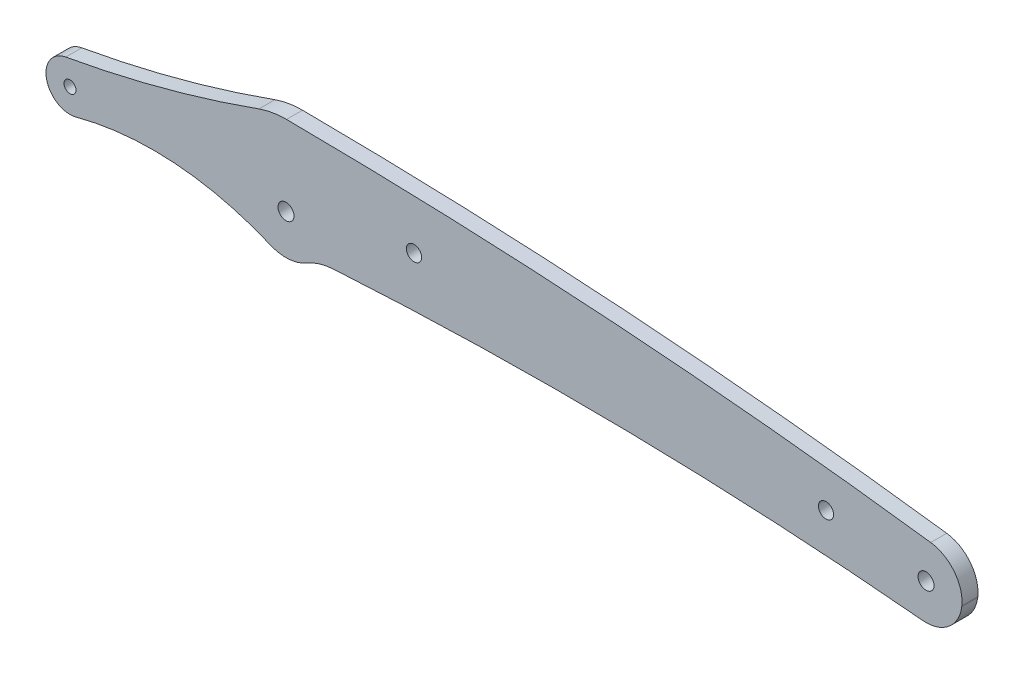
ISO-10303-21;
HEADER;
FILE_DESCRIPTION(('STEP AP214'),'2;1');
FILE_NAME('part.step','',(''),(''),'','','');
FILE_SCHEMA(('AUTOMOTIVE_DESIGN { 1 0 10303 214 1 1 1 1 }'));
ENDSEC;
DATA;
#1=APPLICATION_CONTEXT('core data for automotive mechanical design processes');
#2=APPLICATION_PROTOCOL_DEFINITION('international standard','automotive_design',2000,#1);
#3=PRODUCT_CONTEXT('',#1,'mechanical');
#4=PRODUCT('Part','Part','',(#3));
#5=PRODUCT_RELATED_PRODUCT_CATEGORY('part','',(#4));
#6=PRODUCT_DEFINITION_FORMATION('','',#4);
#7=PRODUCT_DEFINITION_CONTEXT('part definition',#1,'design');
#8=PRODUCT_DEFINITION('design','',#6,#7);
#9=PRODUCT_DEFINITION_SHAPE('','',#8);
#10=(LENGTH_UNIT() NAMED_UNIT(*) SI_UNIT(.MILLI.,.METRE.));
#11=(NAMED_UNIT(*) PLANE_ANGLE_UNIT() SI_UNIT($,.RADIAN.));
#12=(NAMED_UNIT(*) SI_UNIT($,.STERADIAN.) SOLID_ANGLE_UNIT());
#13=UNCERTAINTY_MEASURE_WITH_UNIT(LENGTH_MEASURE(1.E-05),#10,'distance_accuracy_value','');
#14=(GEOMETRIC_REPRESENTATION_CONTEXT(3) GLOBAL_UNCERTAINTY_ASSIGNED_CONTEXT((#13)) GLOBAL_UNIT_ASSIGNED_CONTEXT((#10,
#11,#12)) REPRESENTATION_CONTEXT('',''));
#15=CARTESIAN_POINT('',(0.,0.,0.));
#16=DIRECTION('',(0.,0.,1.));
#17=DIRECTION('',(1.,0.,0.));
#18=AXIS2_PLACEMENT_3D('',#15,#16,#17);
#19=CARTESIAN_POINT('',(160.000000000001,2.22044604925031E-13,4.));
#20=DIRECTION('',(0.,0.,1.));
#21=DIRECTION('',(1.,0.,0.));
#22=AXIS2_PLACEMENT_3D('',#19,#20,#21);
#23=PLANE('',#22);
#24=CARTESIAN_POINT('',(160.000000000001,2.22044604925031E-13,4.));
#25=DIRECTION('',(0.,0.,1.));
#26=DIRECTION('',(1.,0.,0.));
#27=AXIS2_PLACEMENT_3D('',#24,#25,#26);
#28=CIRCLE('',#27,2.);
#29=CARTESIAN_POINT('',(162.000000000001,2.22044604925031E-13,4.));
#30=VERTEX_POINT('',#29);
#31=EDGE_CURVE('E278',#30,#30,#28,.T.);
#32=ORIENTED_EDGE('',*,*,#31,.F.);
#33=EDGE_LOOP('',(#32));
#34=FACE_BOUND('',#33,.T.);
#35=CARTESIAN_POINT('',(0.,0.,4.));
#36=DIRECTION('',(0.,0.,1.));
#37=DIRECTION('',(1.,0.,0.));
#38=AXIS2_PLACEMENT_3D('',#35,#36,#37);
#39=CIRCLE('',#38,1.99999999999981);
#40=CARTESIAN_POINT('',(1.99999999999981,0.,4.));
#41=VERTEX_POINT('',#40);
#42=EDGE_CURVE('E283',#41,#41,#39,.T.);
#43=ORIENTED_EDGE('',*,*,#42,.F.);
#44=EDGE_LOOP('',(#43));
#45=FACE_BOUND('',#44,.T.);
#46=CARTESIAN_POINT('',(135.,2.80000000000036,4.));
#47=DIRECTION('',(0.,0.,1.));
#48=DIRECTION('',(1.,0.,0.));
#49=AXIS2_PLACEMENT_3D('',#46,#47,#48);
#50=CIRCLE('',#49,1.89999999999999);
#51=CARTESIAN_POINT('',(136.9,2.80000000000036,4.));
#52=VERTEX_POINT('',#51);
#53=EDGE_CURVE('E295',#52,#52,#50,.T.);
#54=ORIENTED_EDGE('',*,*,#53,.F.);
#55=EDGE_LOOP('',(#54));
#56=FACE_BOUND('',#55,.T.);
#57=CARTESIAN_POINT('',(160.000000000001,2.22044604925031E-13,4.));
#58=DIRECTION('',(0.,0.,1.));
#59=DIRECTION('',(1.,0.,0.));
#60=AXIS2_PLACEMENT_3D('',#57,#58,#59);
#61=CIRCLE('',#60,9.00000000000021);
#62=CARTESIAN_POINT('',(168.953879648192,-0.909966617905988,4.));
#63=VERTEX_POINT('',#62);
#64=CARTESIAN_POINT('',(161.173821165765,8.92312410934704,4.));
#65=VERTEX_POINT('',#64);
#66=EDGE_CURVE('E171',#63,#65,#61,.T.);
#67=ORIENTED_EDGE('',*,*,#66,.T.);
#68=CARTESIAN_POINT('',(-8.37812500000232,-1279.97258057409,4.));
#69=DIRECTION('',(0.,0.,1.));
#70=DIRECTION('',(1.,0.,0.));
#71=AXIS2_PLACEMENT_3D('',#68,#69,#70);
#72=CIRCLE('',#71,1300.);
#73=CARTESIAN_POINT('',(0.130908203289036,19.9995715714698,4.));
#74=VERTEX_POINT('',#73);
#75=EDGE_CURVE('E104',#65,#74,#72,.T.);
#76=ORIENTED_EDGE('',*,*,#75,.T.);
#77=CARTESIAN_POINT('',(0.,0.,4.));
#78=DIRECTION('',(0.,0.,1.));
#79=DIRECTION('',(1.,0.,0.));
#80=AXIS2_PLACEMENT_3D('',#77,#78,#79);
#81=CIRCLE('',#80,20.0000000000005);
#82=CARTESIAN_POINT('',(-6.75925925923691,18.8231882067423,4.));
#83=VERTEX_POINT('',#82);
#84=EDGE_CURVE('E195',#74,#83,#81,.T.);
#85=ORIENTED_EDGE('',*,*,#84,.T.);
#86=CARTESIAN_POINT('',(-108.14814814815,301.171011307739,4.));
#87=DIRECTION('',(0.,0.,-1.));
#88=DIRECTION('',(1.,0.,0.));
#89=AXIS2_PLACEMENT_3D('',#86,#87,#88);
#90=CIRCLE('',#89,300.);
#91=CARTESIAN_POINT('',(-55.0617283950615,5.90531394721067,4.));
#92=VERTEX_POINT('',#91);
#93=EDGE_CURVE('E214',#83,#92,#90,.T.);
#94=ORIENTED_EDGE('',*,*,#93,.T.);
#95=CARTESIAN_POINT('',(-54.0000000000002,2.22044604925031E-13,4.));
#96=DIRECTION('',(0.,0.,1.));
#97=DIRECTION('',(1.,0.,0.));
#98=AXIS2_PLACEMENT_3D('',#95,#96,#97);
#99=CIRCLE('',#98,6.00000000000002);
#100=CARTESIAN_POINT('',(-52.4554183813337,-5.79778126728451,4.));
#101=VERTEX_POINT('',#100);
#102=EDGE_CURVE('E211',#92,#101,#99,.T.);
#103=ORIENTED_EDGE('',*,*,#102,.T.);
#104=CARTESIAN_POINT('',(-33.1481481481481,-78.2700471083826,4.));
#105=DIRECTION('',(0.,0.,-1.));
#106=DIRECTION('',(1.,0.,0.));
#107=AXIS2_PLACEMENT_3D('',#104,#105,#106);
#108=CIRCLE('',#107,75.0000000000002);
#109=CARTESIAN_POINT('',(-3.89978213507676,-9.20824083627995,4.));
#110=VERTEX_POINT('',#109);
#111=EDGE_CURVE('E213',#101,#110,#108,.T.);
#112=ORIENTED_EDGE('',*,*,#111,.T.);
#113=CARTESIAN_POINT('',(0.,0.,4.));
#114=DIRECTION('',(0.,0.,1.));
#115=DIRECTION('',(1.,0.,0.));
#116=AXIS2_PLACEMENT_3D('',#113,#114,#115);
#117=CIRCLE('',#116,9.99999999999973);
#118=CARTESIAN_POINT('',(5.08680197539365,-8.60955548580331,4.));
#119=VERTEX_POINT('',#118);
#120=EDGE_CURVE('E216',#110,#119,#117,.T.);
#121=ORIENTED_EDGE('',*,*,#120,.T.);
#122=CARTESIAN_POINT('',(12.717004938478,-21.5238887145126,4.));
#123=DIRECTION('',(0.,0.,-1.));
#124=DIRECTION('',(1.,0.,0.));
#125=AXIS2_PLACEMENT_3D('',#122,#123,#124);
#126=CIRCLE('',#125,15.0000000000003);
#127=CARTESIAN_POINT('',(11.7980264082176,-6.55206589760323,4.));
#128=VERTEX_POINT('',#127);
#129=EDGE_CURVE('E132',#119,#128,#126,.T.);
#130=ORIENTED_EDGE('',*,*,#129,.T.);
#131=CARTESIAN_POINT('',(70.000000000003,-954.767510967984,4.));
#132=DIRECTION('',(0.,0.,-1.));
#133=DIRECTION('',(1.,0.,0.));
#134=AXIS2_PLACEMENT_3D('',#131,#132,#133);
#135=CIRCLE('',#134,950.);
#136=CARTESIAN_POINT('',(159.15537017727,-8.96027903932406,4.));
#137=VERTEX_POINT('',#136);
#138=EDGE_CURVE('E126',#128,#137,#135,.T.);
#139=ORIENTED_EDGE('',*,*,#138,.T.);
#140=CARTESIAN_POINT('',(160.000000000001,2.22044604925031E-13,4.));
#141=DIRECTION('',(0.,0.,1.));
#142=DIRECTION('',(1.,0.,0.));
#143=AXIS2_PLACEMENT_3D('',#140,#141,#142);
#144=CIRCLE('',#143,9.00000000000034);
#145=CARTESIAN_POINT('',(168.931448961832,-1.10870169216623,4.));
#146=VERTEX_POINT('',#145);
#147=EDGE_CURVE('E130',#137,#146,#144,.T.);
#148=ORIENTED_EDGE('',*,*,#147,.T.);
#149=DIRECTION('',(0.112155162604876,0.993690706156133,0.));
#150=VECTOR('',#149,1.);
#151=CARTESIAN_POINT('',(168.953879648192,-0.909966617905988,4.));
#152=LINE('',#151,#150);
#153=EDGE_CURVE('E52',#146,#63,#152,.T.);
#154=ORIENTED_EDGE('',*,*,#153,.T.);
#155=EDGE_LOOP('',(#67,#76,#85,#94,#103,#112,#121,#130,#139,#148,#154));
#156=FACE_BOUND('',#155,.T.);
#157=CARTESIAN_POINT('',(32.0000000000005,7.00000000000012,4.));
#158=DIRECTION('',(0.,0.,1.));
#159=DIRECTION('',(1.,0.,0.));
#160=AXIS2_PLACEMENT_3D('',#157,#158,#159);
#161=CIRCLE('',#160,1.90000000000003);
#162=CARTESIAN_POINT('',(33.9000000000005,7.00000000000012,4.));
#163=VERTEX_POINT('',#162);
#164=EDGE_CURVE('E154',#163,#163,#161,.T.);
#165=ORIENTED_EDGE('',*,*,#164,.F.);
#166=EDGE_LOOP('',(#165));
#167=FACE_BOUND('',#166,.T.);
#168=CARTESIAN_POINT('',(-54.0000000000002,2.22044604925031E-13,4.));
#169=DIRECTION('',(0.,0.,1.));
#170=DIRECTION('',(1.,0.,0.));
#171=AXIS2_PLACEMENT_3D('',#168,#169,#170);
#172=CIRCLE('',#171,1.50000000000003);
#173=CARTESIAN_POINT('',(-52.5000000000002,2.22044604925031E-13,4.));
#174=VERTEX_POINT('',#173);
#175=EDGE_CURVE('E289',#174,#174,#172,.T.);
#176=ORIENTED_EDGE('',*,*,#175,.F.);
#177=EDGE_LOOP('',(#176));
#178=FACE_BOUND('',#177,.T.);
#179=ADVANCED_FACE('F35',(#34,#45,#56,#156,#167,#178),#23,.T.);
#180=CARTESIAN_POINT('',(160.000000000001,2.22044604925031E-13,0.));
#181=DIRECTION('',(0.,0.,1.));
#182=DIRECTION('',(1.,0.,0.));
#183=AXIS2_PLACEMENT_3D('',#180,#181,#182);
#184=PLANE('',#183);
#185=CARTESIAN_POINT('',(160.000000000001,2.22044604925031E-13,0.));
#186=DIRECTION('',(0.,0.,1.));
#187=DIRECTION('',(1.,0.,0.));
#188=AXIS2_PLACEMENT_3D('',#185,#186,#187);
#189=CIRCLE('',#188,2.);
#190=CARTESIAN_POINT('',(162.000000000001,2.22044604925031E-13,0.));
#191=VERTEX_POINT('',#190);
#192=EDGE_CURVE('E276',#191,#191,#189,.T.);
#193=ORIENTED_EDGE('',*,*,#192,.T.);
#194=EDGE_LOOP('',(#193));
#195=FACE_BOUND('',#194,.T.);
#196=CARTESIAN_POINT('',(0.,0.,0.));
#197=DIRECTION('',(0.,0.,1.));
#198=DIRECTION('',(1.,0.,0.));
#199=AXIS2_PLACEMENT_3D('',#196,#197,#198);
#200=CIRCLE('',#199,1.99999999999981);
#201=CARTESIAN_POINT('',(1.99999999999981,0.,0.));
#202=VERTEX_POINT('',#201);
#203=EDGE_CURVE('E280',#202,#202,#200,.T.);
#204=ORIENTED_EDGE('',*,*,#203,.T.);
#205=EDGE_LOOP('',(#204));
#206=FACE_BOUND('',#205,.T.);
#207=CARTESIAN_POINT('',(135.,2.80000000000036,0.));
#208=DIRECTION('',(0.,0.,1.));
#209=DIRECTION('',(1.,0.,0.));
#210=AXIS2_PLACEMENT_3D('',#207,#208,#209);
#211=CIRCLE('',#210,1.89999999999999);
#212=CARTESIAN_POINT('',(136.9,2.80000000000036,0.));
#213=VERTEX_POINT('',#212);
#214=EDGE_CURVE('E292',#213,#213,#211,.T.);
#215=ORIENTED_EDGE('',*,*,#214,.T.);
#216=EDGE_LOOP('',(#215));
#217=FACE_BOUND('',#216,.T.);
#218=CARTESIAN_POINT('',(160.000000000001,2.22044604925031E-13,0.));
#219=DIRECTION('',(0.,0.,1.));
#220=DIRECTION('',(1.,0.,0.));
#221=AXIS2_PLACEMENT_3D('',#218,#219,#220);
#222=CIRCLE('',#221,9.00000000000021);
#223=CARTESIAN_POINT('',(168.953879648192,-0.909966617905988,0.));
#224=VERTEX_POINT('',#223);
#225=CARTESIAN_POINT('',(161.173821165765,8.92312410934704,0.));
#226=VERTEX_POINT('',#225);
#227=EDGE_CURVE('E150',#224,#226,#222,.T.);
#228=ORIENTED_EDGE('',*,*,#227,.F.);
#229=DIRECTION('',(0.112155162604876,0.993690706156133,0.));
#230=VECTOR('',#229,1.);
#231=CARTESIAN_POINT('',(168.953879648192,-0.909966617905988,0.));
#232=LINE('',#231,#230);
#233=CARTESIAN_POINT('',(168.931448961832,-1.10870169216623,0.));
#234=VERTEX_POINT('',#233);
#235=EDGE_CURVE('E96',#234,#224,#232,.T.);
#236=ORIENTED_EDGE('',*,*,#235,.F.);
#237=CARTESIAN_POINT('',(160.000000000001,2.22044604925031E-13,0.));
#238=DIRECTION('',(0.,0.,1.));
#239=DIRECTION('',(1.,0.,0.));
#240=AXIS2_PLACEMENT_3D('',#237,#238,#239);
#241=CIRCLE('',#240,9.00000000000034);
#242=CARTESIAN_POINT('',(159.15537017727,-8.96027903932406,0.));
#243=VERTEX_POINT('',#242);
#244=EDGE_CURVE('E90',#243,#234,#241,.T.);
#245=ORIENTED_EDGE('',*,*,#244,.F.);
#246=CARTESIAN_POINT('',(70.000000000003,-954.767510967984,0.));
#247=DIRECTION('',(0.,0.,-1.));
#248=DIRECTION('',(1.,0.,0.));
#249=AXIS2_PLACEMENT_3D('',#246,#247,#248);
#250=CIRCLE('',#249,950.);
#251=CARTESIAN_POINT('',(11.7980264082176,-6.55206589760323,0.));
#252=VERTEX_POINT('',#251);
#253=EDGE_CURVE('E140',#252,#243,#250,.T.);
#254=ORIENTED_EDGE('',*,*,#253,.F.);
#255=CARTESIAN_POINT('',(12.717004938478,-21.5238887145126,0.));
#256=DIRECTION('',(0.,0.,-1.));
#257=DIRECTION('',(1.,0.,0.));
#258=AXIS2_PLACEMENT_3D('',#255,#256,#257);
#259=CIRCLE('',#258,15.0000000000003);
#260=CARTESIAN_POINT('',(5.08680197539365,-8.60955548580331,0.));
#261=VERTEX_POINT('',#260);
#262=EDGE_CURVE('E166',#261,#252,#259,.T.);
#263=ORIENTED_EDGE('',*,*,#262,.F.);
#264=CARTESIAN_POINT('',(0.,0.,0.));
#265=DIRECTION('',(0.,0.,1.));
#266=DIRECTION('',(1.,0.,0.));
#267=AXIS2_PLACEMENT_3D('',#264,#265,#266);
#268=CIRCLE('',#267,9.99999999999973);
#269=CARTESIAN_POINT('',(-3.89978213507676,-9.20824083627995,0.));
#270=VERTEX_POINT('',#269);
#271=EDGE_CURVE('E164',#270,#261,#268,.T.);
#272=ORIENTED_EDGE('',*,*,#271,.F.);
#273=CARTESIAN_POINT('',(-33.1481481481481,-78.2700471083826,0.));
#274=DIRECTION('',(0.,0.,-1.));
#275=DIRECTION('',(1.,0.,0.));
#276=AXIS2_PLACEMENT_3D('',#273,#274,#275);
#277=CIRCLE('',#276,75.0000000000002);
#278=CARTESIAN_POINT('',(-52.4554183813337,-5.79778126728451,0.));
#279=VERTEX_POINT('',#278);
#280=EDGE_CURVE('E162',#279,#270,#277,.T.);
#281=ORIENTED_EDGE('',*,*,#280,.F.);
#282=CARTESIAN_POINT('',(-54.0000000000002,2.22044604925031E-13,0.));
#283=DIRECTION('',(0.,0.,1.));
#284=DIRECTION('',(1.,0.,0.));
#285=AXIS2_PLACEMENT_3D('',#282,#283,#284);
#286=CIRCLE('',#285,6.00000000000002);
#287=CARTESIAN_POINT('',(-55.0617283950615,5.90531394721067,0.));
#288=VERTEX_POINT('',#287);
#289=EDGE_CURVE('E160',#288,#279,#286,.T.);
#290=ORIENTED_EDGE('',*,*,#289,.F.);
#291=CARTESIAN_POINT('',(-108.14814814815,301.171011307739,0.));
#292=DIRECTION('',(0.,0.,-1.));
#293=DIRECTION('',(1.,0.,0.));
#294=AXIS2_PLACEMENT_3D('',#291,#292,#293);
#295=CIRCLE('',#294,300.);
#296=CARTESIAN_POINT('',(-6.75925925923691,18.8231882067423,0.));
#297=VERTEX_POINT('',#296);
#298=EDGE_CURVE('E158',#297,#288,#295,.T.);
#299=ORIENTED_EDGE('',*,*,#298,.F.);
#300=CARTESIAN_POINT('',(0.,0.,0.));
#301=DIRECTION('',(0.,0.,1.));
#302=DIRECTION('',(1.,0.,0.));
#303=AXIS2_PLACEMENT_3D('',#300,#301,#302);
#304=CIRCLE('',#303,20.0000000000005);
#305=CARTESIAN_POINT('',(0.130908203289036,19.9995715714698,0.));
#306=VERTEX_POINT('',#305);
#307=EDGE_CURVE('E156',#306,#297,#304,.T.);
#308=ORIENTED_EDGE('',*,*,#307,.F.);
#309=CARTESIAN_POINT('',(-8.37812500000232,-1279.97258057409,0.));
#310=DIRECTION('',(0.,0.,1.));
#311=DIRECTION('',(1.,0.,0.));
#312=AXIS2_PLACEMENT_3D('',#309,#310,#311);
#313=CIRCLE('',#312,1300.);
#314=EDGE_CURVE('E153',#226,#306,#313,.T.);
#315=ORIENTED_EDGE('',*,*,#314,.F.);
#316=EDGE_LOOP('',(#228,#236,#245,#254,#263,#272,#281,#290,#299,#308,#315));
#317=FACE_BOUND('',#316,.T.);
#318=CARTESIAN_POINT('',(32.0000000000005,7.00000000000012,0.));
#319=DIRECTION('',(0.,0.,1.));
#320=DIRECTION('',(1.,0.,0.));
#321=AXIS2_PLACEMENT_3D('',#318,#319,#320);
#322=CIRCLE('',#321,1.90000000000003);
#323=CARTESIAN_POINT('',(33.9000000000005,7.00000000000012,0.));
#324=VERTEX_POINT('',#323);
#325=EDGE_CURVE('E298',#324,#324,#322,.T.);
#326=ORIENTED_EDGE('',*,*,#325,.T.);
#327=EDGE_LOOP('',(#326));
#328=FACE_BOUND('',#327,.T.);
#329=CARTESIAN_POINT('',(-54.0000000000002,2.22044604925031E-13,0.));
#330=DIRECTION('',(0.,0.,1.));
#331=DIRECTION('',(1.,0.,0.));
#332=AXIS2_PLACEMENT_3D('',#329,#330,#331);
#333=CIRCLE('',#332,1.50000000000003);
#334=CARTESIAN_POINT('',(-52.5000000000002,2.22044604925031E-13,0.));
#335=VERTEX_POINT('',#334);
#336=EDGE_CURVE('E286',#335,#335,#333,.T.);
#337=ORIENTED_EDGE('',*,*,#336,.T.);
#338=EDGE_LOOP('',(#337));
#339=FACE_BOUND('',#338,.T.);
#340=ADVANCED_FACE('F199',(#195,#206,#217,#317,#328,#339),#184,.F.);
#341=CARTESIAN_POINT('',(160.000000000001,2.22044604925031E-13,4.));
#342=DIRECTION('',(0.,0.,-1.));
#343=DIRECTION('',(-1.,0.,0.));
#344=AXIS2_PLACEMENT_3D('',#341,#342,#343);
#345=CYLINDRICAL_SURFACE('',#344,9.00000000000021);
#346=ORIENTED_EDGE('',*,*,#227,.T.);
#347=DIRECTION('',(0.,0.,-1.));
#348=VECTOR('',#347,1.);
#349=CARTESIAN_POINT('',(161.173821165765,8.92312410934704,4.));
#350=LINE('',#349,#348);
#351=EDGE_CURVE('E11',#65,#226,#350,.T.);
#352=ORIENTED_EDGE('',*,*,#351,.F.);
#353=ORIENTED_EDGE('',*,*,#66,.F.);
#354=DIRECTION('',(0.,0.,-1.));
#355=VECTOR('',#354,1.);
#356=CARTESIAN_POINT('',(168.953879648192,-0.909966617905988,4.));
#357=LINE('',#356,#355);
#358=EDGE_CURVE('E146',#63,#224,#357,.T.);
#359=ORIENTED_EDGE('',*,*,#358,.T.);
#360=EDGE_LOOP('',(#346,#352,#353,#359));
#361=FACE_BOUND('',#360,.T.);
#362=ADVANCED_FACE('F37',(#361),#345,.T.);
#363=CARTESIAN_POINT('',(-8.37812500000232,-1279.97258057409,4.));
#364=DIRECTION('',(0.,0.,-1.));
#365=DIRECTION('',(-1.,0.,0.));
#366=AXIS2_PLACEMENT_3D('',#363,#364,#365);
#367=CYLINDRICAL_SURFACE('',#366,1300.);
#368=ORIENTED_EDGE('',*,*,#314,.T.);
#369=DIRECTION('',(0.,0.,-1.));
#370=VECTOR('',#369,1.);
#371=CARTESIAN_POINT('',(0.130908203289036,19.9995715714698,4.));
#372=LINE('',#371,#370);
#373=EDGE_CURVE('E44',#74,#306,#372,.T.);
#374=ORIENTED_EDGE('',*,*,#373,.F.);
#375=ORIENTED_EDGE('',*,*,#75,.F.);
#376=ORIENTED_EDGE('',*,*,#351,.T.);
#377=EDGE_LOOP('',(#368,#374,#375,#376));
#378=FACE_BOUND('',#377,.T.);
#379=ADVANCED_FACE('F407',(#378),#367,.T.);
#380=CARTESIAN_POINT('',(0.,0.,4.));
#381=DIRECTION('',(0.,0.,-1.));
#382=DIRECTION('',(-1.,0.,0.));
#383=AXIS2_PLACEMENT_3D('',#380,#381,#382);
#384=CYLINDRICAL_SURFACE('',#383,20.0000000000005);
#385=ORIENTED_EDGE('',*,*,#307,.T.);
#386=DIRECTION('',(0.,0.,-1.));
#387=VECTOR('',#386,1.);
#388=CARTESIAN_POINT('',(-6.75925925923691,18.8231882067423,4.));
#389=LINE('',#388,#387);
#390=EDGE_CURVE('E187',#83,#297,#389,.T.);
#391=ORIENTED_EDGE('',*,*,#390,.F.);
#392=ORIENTED_EDGE('',*,*,#84,.F.);
#393=ORIENTED_EDGE('',*,*,#373,.T.);
#394=EDGE_LOOP('',(#385,#391,#392,#393));
#395=FACE_BOUND('',#394,.T.);
#396=ADVANCED_FACE('F193',(#395),#384,.T.);
#397=CARTESIAN_POINT('',(-108.14814814815,301.171011307739,4.));
#398=DIRECTION('',(0.,0.,-1.));
#399=DIRECTION('',(-1.,0.,0.));
#400=AXIS2_PLACEMENT_3D('',#397,#398,#399);
#401=CYLINDRICAL_SURFACE('',#400,300.);
#402=ORIENTED_EDGE('',*,*,#298,.T.);
#403=DIRECTION('',(0.,0.,-1.));
#404=VECTOR('',#403,1.);
#405=CARTESIAN_POINT('',(-55.0617283950615,5.90531394721067,4.));
#406=LINE('',#405,#404);
#407=EDGE_CURVE('E184',#92,#288,#406,.T.);
#408=ORIENTED_EDGE('',*,*,#407,.F.);
#409=ORIENTED_EDGE('',*,*,#93,.F.);
#410=ORIENTED_EDGE('',*,*,#390,.T.);
#411=EDGE_LOOP('',(#402,#408,#409,#410));
#412=FACE_BOUND('',#411,.T.);
#413=ADVANCED_FACE('F205',(#412),#401,.F.);
#414=CARTESIAN_POINT('',(-54.0000000000002,2.22044604925031E-13,4.));
#415=DIRECTION('',(0.,0.,-1.));
#416=DIRECTION('',(-1.,0.,0.));
#417=AXIS2_PLACEMENT_3D('',#414,#415,#416);
#418=CYLINDRICAL_SURFACE('',#417,6.00000000000002);
#419=ORIENTED_EDGE('',*,*,#289,.T.);
#420=DIRECTION('',(0.,0.,-1.));
#421=VECTOR('',#420,1.);
#422=CARTESIAN_POINT('',(-52.4554183813337,-5.79778126728451,4.));
#423=LINE('',#422,#421);
#424=EDGE_CURVE('E181',#101,#279,#423,.T.);
#425=ORIENTED_EDGE('',*,*,#424,.F.);
#426=ORIENTED_EDGE('',*,*,#102,.F.);
#427=ORIENTED_EDGE('',*,*,#407,.T.);
#428=EDGE_LOOP('',(#419,#425,#426,#427));
#429=FACE_BOUND('',#428,.T.);
#430=ADVANCED_FACE('F209',(#429),#418,.T.);
#431=CARTESIAN_POINT('',(-33.1481481481481,-78.2700471083826,4.));
#432=DIRECTION('',(0.,0.,-1.));
#433=DIRECTION('',(-1.,0.,0.));
#434=AXIS2_PLACEMENT_3D('',#431,#432,#433);
#435=CYLINDRICAL_SURFACE('',#434,75.0000000000002);
#436=ORIENTED_EDGE('',*,*,#280,.T.);
#437=DIRECTION('',(0.,0.,-1.));
#438=VECTOR('',#437,1.);
#439=CARTESIAN_POINT('',(-3.89978213507676,-9.20824083627995,4.));
#440=LINE('',#439,#438);
#441=EDGE_CURVE('E178',#110,#270,#440,.T.);
#442=ORIENTED_EDGE('',*,*,#441,.F.);
#443=ORIENTED_EDGE('',*,*,#111,.F.);
#444=ORIENTED_EDGE('',*,*,#424,.T.);
#445=EDGE_LOOP('',(#436,#442,#443,#444));
#446=FACE_BOUND('',#445,.T.);
#447=ADVANCED_FACE('F373',(#446),#435,.F.);
#448=CARTESIAN_POINT('',(0.,0.,4.));
#449=DIRECTION('',(0.,0.,-1.));
#450=DIRECTION('',(-1.,0.,0.));
#451=AXIS2_PLACEMENT_3D('',#448,#449,#450);
#452=CYLINDRICAL_SURFACE('',#451,9.99999999999973);
#453=ORIENTED_EDGE('',*,*,#271,.T.);
#454=DIRECTION('',(0.,0.,-1.));
#455=VECTOR('',#454,1.);
#456=CARTESIAN_POINT('',(5.08680197539365,-8.60955548580331,4.));
#457=LINE('',#456,#455);
#458=EDGE_CURVE('E175',#119,#261,#457,.T.);
#459=ORIENTED_EDGE('',*,*,#458,.F.);
#460=ORIENTED_EDGE('',*,*,#120,.F.);
#461=ORIENTED_EDGE('',*,*,#441,.T.);
#462=EDGE_LOOP('',(#453,#459,#460,#461));
#463=FACE_BOUND('',#462,.T.);
#464=ADVANCED_FACE('F225',(#463),#452,.T.);
#465=CARTESIAN_POINT('',(12.717004938478,-21.5238887145126,4.));
#466=DIRECTION('',(0.,0.,-1.));
#467=DIRECTION('',(-1.,0.,0.));
#468=AXIS2_PLACEMENT_3D('',#465,#466,#467);
#469=CYLINDRICAL_SURFACE('',#468,15.0000000000003);
#470=ORIENTED_EDGE('',*,*,#262,.T.);
#471=DIRECTION('',(0.,0.,-1.));
#472=VECTOR('',#471,1.);
#473=CARTESIAN_POINT('',(11.7980264082176,-6.55206589760323,4.));
#474=LINE('',#473,#472);
#475=EDGE_CURVE('E141',#128,#252,#474,.T.);
#476=ORIENTED_EDGE('',*,*,#475,.F.);
#477=ORIENTED_EDGE('',*,*,#129,.F.);
#478=ORIENTED_EDGE('',*,*,#458,.T.);
#479=EDGE_LOOP('',(#470,#476,#477,#478));
#480=FACE_BOUND('',#479,.T.);
#481=ADVANCED_FACE('F229',(#480),#469,.F.);
#482=CARTESIAN_POINT('',(70.000000000003,-954.767510967984,4.));
#483=DIRECTION('',(0.,0.,-1.));
#484=DIRECTION('',(-1.,0.,0.));
#485=AXIS2_PLACEMENT_3D('',#482,#483,#484);
#486=CYLINDRICAL_SURFACE('',#485,950.);
#487=ORIENTED_EDGE('',*,*,#253,.T.);
#488=DIRECTION('',(0.,0.,-1.));
#489=VECTOR('',#488,1.);
#490=CARTESIAN_POINT('',(159.15537017727,-8.96027903932406,4.));
#491=LINE('',#490,#489);
#492=EDGE_CURVE('E137',#137,#243,#491,.T.);
#493=ORIENTED_EDGE('',*,*,#492,.F.);
#494=ORIENTED_EDGE('',*,*,#138,.F.);
#495=ORIENTED_EDGE('',*,*,#475,.T.);
#496=EDGE_LOOP('',(#487,#493,#494,#495));
#497=FACE_BOUND('',#496,.T.);
#498=ADVANCED_FACE('F138',(#497),#486,.F.);
#499=CARTESIAN_POINT('',(160.000000000001,2.22044604925031E-13,4.));
#500=DIRECTION('',(0.,0.,-1.));
#501=DIRECTION('',(-1.,0.,0.));
#502=AXIS2_PLACEMENT_3D('',#499,#500,#501);
#503=CYLINDRICAL_SURFACE('',#502,9.00000000000034);
#504=ORIENTED_EDGE('',*,*,#244,.T.);
#505=DIRECTION('',(0.,0.,-1.));
#506=VECTOR('',#505,1.);
#507=CARTESIAN_POINT('',(168.931448961832,-1.10870169216623,4.));
#508=LINE('',#507,#506);
#509=EDGE_CURVE('E142',#146,#234,#508,.T.);
#510=ORIENTED_EDGE('',*,*,#509,.F.);
#511=ORIENTED_EDGE('',*,*,#147,.F.);
#512=ORIENTED_EDGE('',*,*,#492,.T.);
#513=EDGE_LOOP('',(#504,#510,#511,#512));
#514=FACE_BOUND('',#513,.T.);
#515=ADVANCED_FACE('F144',(#514),#503,.T.);
#516=CARTESIAN_POINT('',(168.953879648192,-0.909966617905988,4.));
#517=DIRECTION('',(-0.993690706156133,0.112155162604876,0.));
#518=DIRECTION('',(-0.112155162604876,-0.993690706156133,0.));
#519=AXIS2_PLACEMENT_3D('',#516,#517,#518);
#520=PLANE('',#519);
#521=ORIENTED_EDGE('',*,*,#235,.T.);
#522=ORIENTED_EDGE('',*,*,#358,.F.);
#523=ORIENTED_EDGE('',*,*,#153,.F.);
#524=ORIENTED_EDGE('',*,*,#509,.T.);
#525=EDGE_LOOP('',(#521,#522,#523,#524));
#526=FACE_BOUND('',#525,.T.);
#527=ADVANCED_FACE('F233',(#526),#520,.F.);
#528=CARTESIAN_POINT('',(32.0000000000005,7.00000000000012,4.));
#529=DIRECTION('',(0.,0.,-1.));
#530=DIRECTION('',(-1.,0.,0.));
#531=AXIS2_PLACEMENT_3D('',#528,#529,#530);
#532=CYLINDRICAL_SURFACE('',#531,1.90000000000003);
#533=ORIENTED_EDGE('',*,*,#164,.T.);
#534=EDGE_LOOP('',(#533));
#535=FACE_BOUND('',#534,.T.);
#536=ORIENTED_EDGE('',*,*,#325,.F.);
#537=EDGE_LOOP('',(#536));
#538=FACE_BOUND('',#537,.T.);
#539=ADVANCED_FACE('F235',(#535,#538),#532,.F.);
#540=CARTESIAN_POINT('',(135.,2.80000000000036,4.));
#541=DIRECTION('',(0.,0.,-1.));
#542=DIRECTION('',(-1.,0.,0.));
#543=AXIS2_PLACEMENT_3D('',#540,#541,#542);
#544=CYLINDRICAL_SURFACE('',#543,1.89999999999999);
#545=ORIENTED_EDGE('',*,*,#53,.T.);
#546=EDGE_LOOP('',(#545));
#547=FACE_BOUND('',#546,.T.);
#548=ORIENTED_EDGE('',*,*,#214,.F.);
#549=EDGE_LOOP('',(#548));
#550=FACE_BOUND('',#549,.T.);
#551=ADVANCED_FACE('F241',(#547,#550),#544,.F.);
#552=CARTESIAN_POINT('',(-54.0000000000002,2.22044604925031E-13,4.));
#553=DIRECTION('',(0.,0.,-1.));
#554=DIRECTION('',(-1.,0.,0.));
#555=AXIS2_PLACEMENT_3D('',#552,#553,#554);
#556=CYLINDRICAL_SURFACE('',#555,1.50000000000003);
#557=ORIENTED_EDGE('',*,*,#175,.T.);
#558=EDGE_LOOP('',(#557));
#559=FACE_BOUND('',#558,.T.);
#560=ORIENTED_EDGE('',*,*,#336,.F.);
#561=EDGE_LOOP('',(#560));
#562=FACE_BOUND('',#561,.T.);
#563=ADVANCED_FACE('F259',(#559,#562),#556,.F.);
#564=CARTESIAN_POINT('',(0.,0.,4.));
#565=DIRECTION('',(0.,0.,-1.));
#566=DIRECTION('',(-1.,0.,0.));
#567=AXIS2_PLACEMENT_3D('',#564,#565,#566);
#568=CYLINDRICAL_SURFACE('',#567,1.99999999999981);
#569=ORIENTED_EDGE('',*,*,#42,.T.);
#570=EDGE_LOOP('',(#569));
#571=FACE_BOUND('',#570,.T.);
#572=ORIENTED_EDGE('',*,*,#203,.F.);
#573=EDGE_LOOP('',(#572));
#574=FACE_BOUND('',#573,.T.);
#575=ADVANCED_FACE('F263',(#571,#574),#568,.F.);
#576=CARTESIAN_POINT('',(160.000000000001,2.22044604925031E-13,0.));
#577=DIRECTION('',(0.,0.,1.));
#578=DIRECTION('',(1.,0.,0.));
#579=AXIS2_PLACEMENT_3D('',#576,#577,#578);
#580=CYLINDRICAL_SURFACE('',#579,2.);
#581=ORIENTED_EDGE('',*,*,#192,.F.);
#582=EDGE_LOOP('',(#581));
#583=FACE_BOUND('',#582,.T.);
#584=ORIENTED_EDGE('',*,*,#31,.T.);
#585=EDGE_LOOP('',(#584));
#586=FACE_BOUND('',#585,.T.);
#587=ADVANCED_FACE('F267',(#583,#586),#580,.F.);
#588=CLOSED_SHELL('',(#179,#340,#362,#379,#396,#413,#430,#447,#464,#481,#498,#515,#527,#539,
#551,#563,#575,#587));
#589=MANIFOLD_SOLID_BREP('B2',#588);
#590=ADVANCED_BREP_SHAPE_REPRESENTATION('',(#18,#589),#14);
#591=SHAPE_DEFINITION_REPRESENTATION(#9,#590);
ENDSEC;
END-ISO-10303-21;
